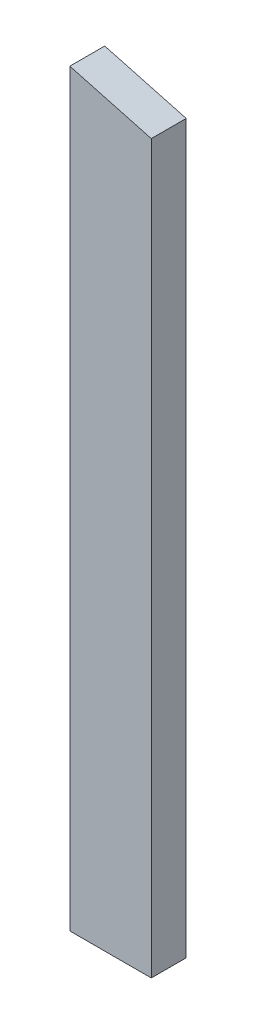
ISO-10303-21;
HEADER;
FILE_DESCRIPTION(('STEP AP214'),'2;1');
FILE_NAME('part.step','',(''),(''),'','','');
FILE_SCHEMA(('AUTOMOTIVE_DESIGN { 1 0 10303 214 1 1 1 1 }'));
ENDSEC;
DATA;
#1=APPLICATION_CONTEXT('core data for automotive mechanical design processes');
#2=APPLICATION_PROTOCOL_DEFINITION('international standard','automotive_design',2000,#1);
#3=PRODUCT_CONTEXT('',#1,'mechanical');
#4=PRODUCT('Part','Part','',(#3));
#5=PRODUCT_RELATED_PRODUCT_CATEGORY('part','',(#4));
#6=PRODUCT_DEFINITION_FORMATION('','',#4);
#7=PRODUCT_DEFINITION_CONTEXT('part definition',#1,'design');
#8=PRODUCT_DEFINITION('design','',#6,#7);
#9=PRODUCT_DEFINITION_SHAPE('','',#8);
#10=(LENGTH_UNIT() NAMED_UNIT(*) SI_UNIT(.MILLI.,.METRE.));
#11=(NAMED_UNIT(*) PLANE_ANGLE_UNIT() SI_UNIT($,.RADIAN.));
#12=(NAMED_UNIT(*) SI_UNIT($,.STERADIAN.) SOLID_ANGLE_UNIT());
#13=UNCERTAINTY_MEASURE_WITH_UNIT(LENGTH_MEASURE(1.E-05),#10,'distance_accuracy_value','');
#14=(GEOMETRIC_REPRESENTATION_CONTEXT(3) GLOBAL_UNCERTAINTY_ASSIGNED_CONTEXT((#13)) GLOBAL_UNIT_ASSIGNED_CONTEXT((#10,
#11,#12)) REPRESENTATION_CONTEXT('',''));
#15=CARTESIAN_POINT('',(0.,0.,0.));
#16=DIRECTION('',(0.,0.,1.));
#17=DIRECTION('',(1.,0.,0.));
#18=AXIS2_PLACEMENT_3D('',#15,#16,#17);
#19=CARTESIAN_POINT('',(0.,34.1967871859219,38.1));
#20=DIRECTION('',(0.,-1.,0.));
#21=DIRECTION('',(1.,0.,0.));
#22=AXIS2_PLACEMENT_3D('',#19,#20,#21);
#23=PLANE('',#22);
#24=DIRECTION('',(-1.,0.,0.));
#25=VECTOR('',#24,1.);
#26=CARTESIAN_POINT('',(0.,34.1967871859219,0.));
#27=LINE('',#26,#25);
#28=CARTESIAN_POINT('',(-250.771290991528,34.1967871859219,0.));
#29=VERTEX_POINT('',#28);
#30=CARTESIAN_POINT('',(-339.671290991527,34.1967871859219,0.));
#31=VERTEX_POINT('',#30);
#32=EDGE_CURVE('E98',#29,#31,#27,.T.);
#33=ORIENTED_EDGE('',*,*,#32,.F.);
#34=DIRECTION('',(0.,0.,-1.));
#35=VECTOR('',#34,1.);
#36=CARTESIAN_POINT('',(-250.771290991528,34.1967871859219,38.1));
#37=LINE('',#36,#35);
#38=CARTESIAN_POINT('',(-250.771290991528,34.1967871859219,38.1));
#39=VERTEX_POINT('',#38);
#40=EDGE_CURVE('E11',#39,#29,#37,.T.);
#41=ORIENTED_EDGE('',*,*,#40,.F.);
#42=DIRECTION('',(-1.,0.,0.));
#43=VECTOR('',#42,1.);
#44=CARTESIAN_POINT('',(0.,34.1967871859219,38.1));
#45=LINE('',#44,#43);
#46=CARTESIAN_POINT('',(-339.671290991527,34.1967871859219,38.1));
#47=VERTEX_POINT('',#46);
#48=EDGE_CURVE('E83',#39,#47,#45,.T.);
#49=ORIENTED_EDGE('',*,*,#48,.T.);
#50=DIRECTION('',(0.,0.,-1.));
#51=VECTOR('',#50,1.);
#52=CARTESIAN_POINT('',(-339.671290991527,34.1967871859219,38.1));
#53=LINE('',#52,#51);
#54=EDGE_CURVE('E51',#47,#31,#53,.T.);
#55=ORIENTED_EDGE('',*,*,#54,.T.);
#56=EDGE_LOOP('',(#33,#41,#49,#55));
#57=FACE_BOUND('',#56,.T.);
#58=ADVANCED_FACE('F35',(#57),#23,.T.);
#59=CARTESIAN_POINT('',(-250.771290991528,0.,38.1));
#60=DIRECTION('',(-1.,0.,0.));
#61=DIRECTION('',(0.,-1.,0.));
#62=AXIS2_PLACEMENT_3D('',#59,#60,#61);
#63=PLANE('',#62);
#64=DIRECTION('',(0.,1.,0.));
#65=VECTOR('',#64,1.);
#66=CARTESIAN_POINT('',(-250.771290991528,0.,0.));
#67=LINE('',#66,#65);
#68=CARTESIAN_POINT('',(-250.771290991527,827.236896999829,0.));
#69=VERTEX_POINT('',#68);
#70=EDGE_CURVE('E89',#29,#69,#67,.T.);
#71=ORIENTED_EDGE('',*,*,#70,.T.);
#72=DIRECTION('',(0.,0.,-1.));
#73=VECTOR('',#72,1.);
#74=CARTESIAN_POINT('',(-250.771290991527,827.236896999829,38.1));
#75=LINE('',#74,#73);
#76=CARTESIAN_POINT('',(-250.771290991527,827.236896999829,38.1));
#77=VERTEX_POINT('',#76);
#78=EDGE_CURVE('E43',#77,#69,#75,.T.);
#79=ORIENTED_EDGE('',*,*,#78,.F.);
#80=DIRECTION('',(0.,1.,0.));
#81=VECTOR('',#80,1.);
#82=CARTESIAN_POINT('',(-250.771290991528,0.,38.1));
#83=LINE('',#82,#81);
#84=EDGE_CURVE('E77',#39,#77,#83,.T.);
#85=ORIENTED_EDGE('',*,*,#84,.F.);
#86=ORIENTED_EDGE('',*,*,#40,.T.);
#87=EDGE_LOOP('',(#71,#79,#85,#86));
#88=FACE_BOUND('',#87,.T.);
#89=ADVANCED_FACE('F87',(#88),#63,.F.);
#90=CARTESIAN_POINT('',(190.953718769038,708.120040435182,38.1));
#91=DIRECTION('',(0.260362499760678,0.965510936612513,0.));
#92=DIRECTION('',(-0.965510936612513,0.260362499760678,0.));
#93=AXIS2_PLACEMENT_3D('',#90,#91,#92);
#94=PLANE('',#93);
#95=DIRECTION('',(0.965510936612513,-0.260362499760678,0.));
#96=VECTOR('',#95,1.);
#97=CARTESIAN_POINT('',(190.953718769038,708.120040435182,0.));
#98=LINE('',#97,#96);
#99=CARTESIAN_POINT('',(-339.671290991527,851.209930707694,0.));
#100=VERTEX_POINT('',#99);
#101=EDGE_CURVE('E101',#100,#69,#98,.T.);
#102=ORIENTED_EDGE('',*,*,#101,.F.);
#103=DIRECTION('',(0.,0.,-1.));
#104=VECTOR('',#103,1.);
#105=CARTESIAN_POINT('',(-339.671290991527,851.209930707694,38.1));
#106=LINE('',#105,#104);
#107=CARTESIAN_POINT('',(-339.671290991527,851.209930707694,38.1));
#108=VERTEX_POINT('',#107);
#109=EDGE_CURVE('E64',#108,#100,#106,.T.);
#110=ORIENTED_EDGE('',*,*,#109,.F.);
#111=DIRECTION('',(0.965510936612513,-0.260362499760678,0.));
#112=VECTOR('',#111,1.);
#113=CARTESIAN_POINT('',(190.953718769038,708.120040435182,38.1));
#114=LINE('',#113,#112);
#115=EDGE_CURVE('E82',#108,#77,#114,.T.);
#116=ORIENTED_EDGE('',*,*,#115,.T.);
#117=ORIENTED_EDGE('',*,*,#78,.T.);
#118=EDGE_LOOP('',(#102,#110,#116,#117));
#119=FACE_BOUND('',#118,.T.);
#120=ADVANCED_FACE('F92',(#119),#94,.T.);
#121=CARTESIAN_POINT('',(-339.671290991527,0.,38.1));
#122=DIRECTION('',(-1.,0.,0.));
#123=DIRECTION('',(0.,-1.,0.));
#124=AXIS2_PLACEMENT_3D('',#121,#122,#123);
#125=PLANE('',#124);
#126=DIRECTION('',(0.,1.,0.));
#127=VECTOR('',#126,1.);
#128=CARTESIAN_POINT('',(-339.671290991527,0.,0.));
#129=LINE('',#128,#127);
#130=EDGE_CURVE('E103',#31,#100,#129,.T.);
#131=ORIENTED_EDGE('',*,*,#130,.F.);
#132=ORIENTED_EDGE('',*,*,#54,.F.);
#133=DIRECTION('',(0.,1.,0.));
#134=VECTOR('',#133,1.);
#135=CARTESIAN_POINT('',(-339.671290991527,0.,38.1));
#136=LINE('',#135,#134);
#137=EDGE_CURVE('E93',#47,#108,#136,.T.);
#138=ORIENTED_EDGE('',*,*,#137,.T.);
#139=ORIENTED_EDGE('',*,*,#109,.T.);
#140=EDGE_LOOP('',(#131,#132,#138,#139));
#141=FACE_BOUND('',#140,.T.);
#142=ADVANCED_FACE('F108',(#141),#125,.T.);
#143=CARTESIAN_POINT('',(0.,0.,38.1));
#144=DIRECTION('',(0.,0.,1.));
#145=DIRECTION('',(1.,0.,0.));
#146=AXIS2_PLACEMENT_3D('',#143,#144,#145);
#147=PLANE('',#146);
#148=ORIENTED_EDGE('',*,*,#48,.F.);
#149=ORIENTED_EDGE('',*,*,#84,.T.);
#150=ORIENTED_EDGE('',*,*,#115,.F.);
#151=ORIENTED_EDGE('',*,*,#137,.F.);
#152=EDGE_LOOP('',(#148,#149,#150,#151));
#153=FACE_BOUND('',#152,.T.);
#154=ADVANCED_FACE('F79',(#153),#147,.T.);
#155=CARTESIAN_POINT('',(0.,0.,0.));
#156=DIRECTION('',(0.,0.,1.));
#157=DIRECTION('',(1.,0.,0.));
#158=AXIS2_PLACEMENT_3D('',#155,#156,#157);
#159=PLANE('',#158);
#160=ORIENTED_EDGE('',*,*,#32,.T.);
#161=ORIENTED_EDGE('',*,*,#130,.T.);
#162=ORIENTED_EDGE('',*,*,#101,.T.);
#163=ORIENTED_EDGE('',*,*,#70,.F.);
#164=EDGE_LOOP('',(#160,#161,#162,#163));
#165=FACE_BOUND('',#164,.T.);
#166=ADVANCED_FACE('F115',(#165),#159,.F.);
#167=CLOSED_SHELL('',(#58,#89,#120,#142,#154,#166));
#168=MANIFOLD_SOLID_BREP('B2',#167);
#169=ADVANCED_BREP_SHAPE_REPRESENTATION('',(#18,#168),#14);
#170=SHAPE_DEFINITION_REPRESENTATION(#9,#169);
ENDSEC;
END-ISO-10303-21;
